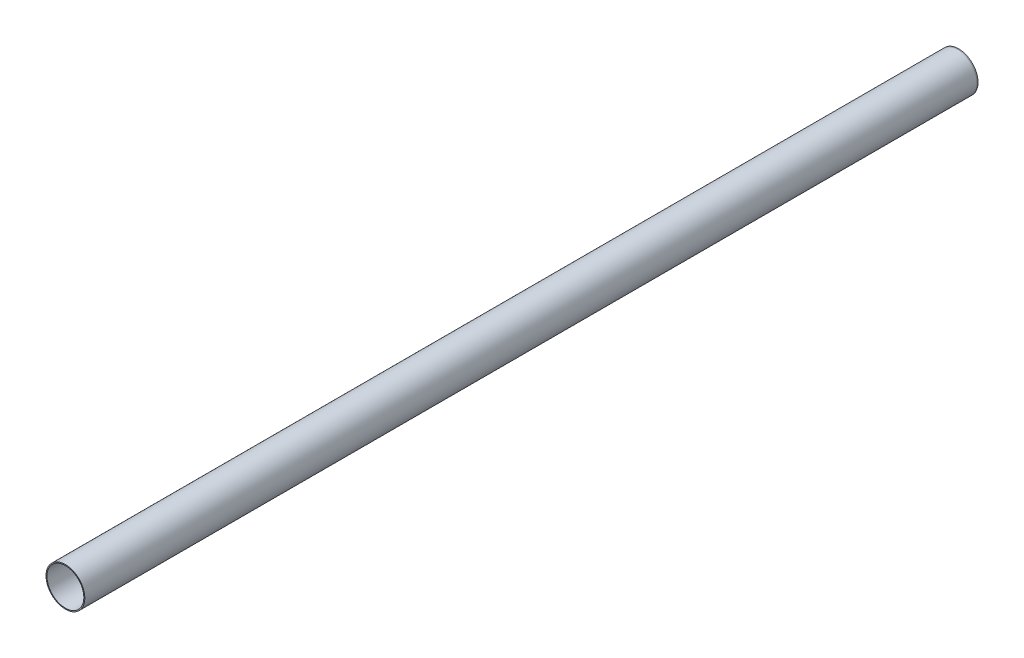
ISO-10303-21;
HEADER;
FILE_DESCRIPTION(('STEP AP214'),'2;1');
FILE_NAME('part.step','',(''),(''),'','','');
FILE_SCHEMA(('AUTOMOTIVE_DESIGN { 1 0 10303 214 1 1 1 1 }'));
ENDSEC;
DATA;
#1=APPLICATION_CONTEXT('core data for automotive mechanical design processes');
#2=APPLICATION_PROTOCOL_DEFINITION('international standard','automotive_design',2000,#1);
#3=PRODUCT_CONTEXT('',#1,'mechanical');
#4=PRODUCT('Part','Part','',(#3));
#5=PRODUCT_RELATED_PRODUCT_CATEGORY('part','',(#4));
#6=PRODUCT_DEFINITION_FORMATION('','',#4);
#7=PRODUCT_DEFINITION_CONTEXT('part definition',#1,'design');
#8=PRODUCT_DEFINITION('design','',#6,#7);
#9=PRODUCT_DEFINITION_SHAPE('','',#8);
#10=(LENGTH_UNIT() NAMED_UNIT(*) SI_UNIT(.MILLI.,.METRE.));
#11=(NAMED_UNIT(*) PLANE_ANGLE_UNIT() SI_UNIT($,.RADIAN.));
#12=(NAMED_UNIT(*) SI_UNIT($,.STERADIAN.) SOLID_ANGLE_UNIT());
#13=UNCERTAINTY_MEASURE_WITH_UNIT(LENGTH_MEASURE(1.E-05),#10,'distance_accuracy_value','');
#14=(GEOMETRIC_REPRESENTATION_CONTEXT(3) GLOBAL_UNCERTAINTY_ASSIGNED_CONTEXT((#13)) GLOBAL_UNIT_ASSIGNED_CONTEXT((#10,
#11,#12)) REPRESENTATION_CONTEXT('',''));
#15=CARTESIAN_POINT('',(0.,0.,0.));
#16=DIRECTION('',(0.,0.,1.));
#17=DIRECTION('',(1.,0.,0.));
#18=AXIS2_PLACEMENT_3D('',#15,#16,#17);
#19=CARTESIAN_POINT('',(0.,0.,-460.5));
#20=DIRECTION('',(0.,0.,1.));
#21=DIRECTION('',(1.,0.,0.));
#22=AXIS2_PLACEMENT_3D('',#19,#20,#21);
#23=CYLINDRICAL_SURFACE('',#22,10.);
#24=CARTESIAN_POINT('',(0.,0.,-460.5));
#25=DIRECTION('',(0.,0.,-1.));
#26=DIRECTION('',(-1.,0.,0.));
#27=AXIS2_PLACEMENT_3D('',#24,#25,#26);
#28=CIRCLE('',#27,10.);
#29=CARTESIAN_POINT('',(-10.,0.,-460.5));
#30=VERTEX_POINT('',#29);
#31=EDGE_CURVE('E12',#30,#30,#28,.T.);
#32=ORIENTED_EDGE('',*,*,#31,.F.);
#33=EDGE_LOOP('',(#32));
#34=FACE_BOUND('',#33,.T.);
#35=CARTESIAN_POINT('',(0.,0.,-460.));
#36=DIRECTION('',(0.,0.,-1.));
#37=DIRECTION('',(-1.,0.,0.));
#38=AXIS2_PLACEMENT_3D('',#35,#36,#37);
#39=CIRCLE('',#38,10.);
#40=CARTESIAN_POINT('',(-10.,0.,-460.));
#41=VERTEX_POINT('',#40);
#42=EDGE_CURVE('E55',#41,#41,#39,.T.);
#43=ORIENTED_EDGE('',*,*,#42,.T.);
#44=EDGE_LOOP('',(#43));
#45=FACE_BOUND('',#44,.T.);
#46=ADVANCED_FACE('F52',(#34,#45),#23,.T.);
#47=CARTESIAN_POINT('',(0.,0.,-460.5));
#48=DIRECTION('',(0.,0.,-1.));
#49=DIRECTION('',(-1.,0.,0.));
#50=AXIS2_PLACEMENT_3D('',#47,#48,#49);
#51=PLANE('',#50);
#52=ORIENTED_EDGE('',*,*,#31,.T.);
#53=EDGE_LOOP('',(#52));
#54=FACE_BOUND('',#53,.T.);
#55=ADVANCED_FACE('F67',(#54),#51,.T.);
#56=CARTESIAN_POINT('',(0.,0.,-460.));
#57=DIRECTION('',(0.,0.,-1.));
#58=DIRECTION('',(-1.,0.,0.));
#59=AXIS2_PLACEMENT_3D('',#56,#57,#58);
#60=PLANE('',#59);
#61=ORIENTED_EDGE('',*,*,#42,.F.);
#62=EDGE_LOOP('',(#61));
#63=FACE_BOUND('',#62,.T.);
#64=ADVANCED_FACE('F65',(#63),#60,.F.);
#65=CLOSED_SHELL('',(#46,#55,#64));
#66=MANIFOLD_SOLID_BREP('B2',#65);
#67=CARTESIAN_POINT('',(0.,0.,-460.));
#68=DIRECTION('',(0.,0.,1.));
#69=DIRECTION('',(1.,0.,0.));
#70=AXIS2_PLACEMENT_3D('',#67,#68,#69);
#71=CYLINDRICAL_SURFACE('',#70,9.5);
#72=CARTESIAN_POINT('',(0.,0.,-460.));
#73=DIRECTION('',(0.,0.,-1.));
#74=DIRECTION('',(-1.,0.,0.));
#75=AXIS2_PLACEMENT_3D('',#72,#73,#74);
#76=CIRCLE('',#75,9.5);
#77=CARTESIAN_POINT('',(-9.5,0.,-460.));
#78=VERTEX_POINT('',#77);
#79=EDGE_CURVE('E100',#78,#78,#76,.T.);
#80=ORIENTED_EDGE('',*,*,#79,.T.);
#81=EDGE_LOOP('',(#80));
#82=FACE_BOUND('',#81,.T.);
#83=CARTESIAN_POINT('',(0.,0.,0.));
#84=DIRECTION('',(0.,0.,-1.));
#85=DIRECTION('',(-1.,0.,0.));
#86=AXIS2_PLACEMENT_3D('',#83,#84,#85);
#87=CIRCLE('',#86,9.5);
#88=CARTESIAN_POINT('',(-9.5,0.,0.));
#89=VERTEX_POINT('',#88);
#90=EDGE_CURVE('E106',#89,#89,#87,.T.);
#91=ORIENTED_EDGE('',*,*,#90,.F.);
#92=EDGE_LOOP('',(#91));
#93=FACE_BOUND('',#92,.T.);
#94=ADVANCED_FACE('F93',(#82,#93),#71,.F.);
#95=CARTESIAN_POINT('',(0.,0.,-460.));
#96=DIRECTION('',(0.,0.,1.));
#97=DIRECTION('',(1.,0.,0.));
#98=AXIS2_PLACEMENT_3D('',#95,#96,#97);
#99=CYLINDRICAL_SURFACE('',#98,10.);
#100=CARTESIAN_POINT('',(0.,0.,-460.));
#101=DIRECTION('',(0.,0.,-1.));
#102=DIRECTION('',(-1.,0.,0.));
#103=AXIS2_PLACEMENT_3D('',#100,#101,#102);
#104=CIRCLE('',#103,10.);
#105=CARTESIAN_POINT('',(-10.,0.,-460.));
#106=VERTEX_POINT('',#105);
#107=EDGE_CURVE('E51',#106,#106,#104,.T.);
#108=ORIENTED_EDGE('',*,*,#107,.F.);
#109=EDGE_LOOP('',(#108));
#110=FACE_BOUND('',#109,.T.);
#111=CARTESIAN_POINT('',(0.,0.,0.));
#112=DIRECTION('',(0.,0.,-1.));
#113=DIRECTION('',(-1.,0.,0.));
#114=AXIS2_PLACEMENT_3D('',#111,#112,#113);
#115=CIRCLE('',#114,10.);
#116=CARTESIAN_POINT('',(-10.,0.,0.));
#117=VERTEX_POINT('',#116);
#118=EDGE_CURVE('E96',#117,#117,#115,.T.);
#119=ORIENTED_EDGE('',*,*,#118,.T.);
#120=EDGE_LOOP('',(#119));
#121=FACE_BOUND('',#120,.T.);
#122=ADVANCED_FACE('F113',(#110,#121),#99,.T.);
#123=CARTESIAN_POINT('',(0.,0.,-460.));
#124=DIRECTION('',(0.,0.,-1.));
#125=DIRECTION('',(-1.,0.,0.));
#126=AXIS2_PLACEMENT_3D('',#123,#124,#125);
#127=PLANE('',#126);
#128=ORIENTED_EDGE('',*,*,#79,.F.);
#129=EDGE_LOOP('',(#128));
#130=FACE_BOUND('',#129,.T.);
#131=ORIENTED_EDGE('',*,*,#107,.T.);
#132=EDGE_LOOP('',(#131));
#133=FACE_BOUND('',#132,.T.);
#134=ADVANCED_FACE('F117',(#130,#133),#127,.T.);
#135=CARTESIAN_POINT('',(0.,0.,0.));
#136=DIRECTION('',(0.,0.,-1.));
#137=DIRECTION('',(-1.,0.,0.));
#138=AXIS2_PLACEMENT_3D('',#135,#136,#137);
#139=PLANE('',#138);
#140=ORIENTED_EDGE('',*,*,#90,.T.);
#141=EDGE_LOOP('',(#140));
#142=FACE_BOUND('',#141,.T.);
#143=ORIENTED_EDGE('',*,*,#118,.F.);
#144=EDGE_LOOP('',(#143));
#145=FACE_BOUND('',#144,.T.);
#146=ADVANCED_FACE('F115',(#142,#145),#139,.F.);
#147=CLOSED_SHELL('',(#94,#122,#134,#146));
#148=MANIFOLD_SOLID_BREP('B7',#147);
#149=ADVANCED_BREP_SHAPE_REPRESENTATION('',(#18,#66,#148),#14);
#150=SHAPE_DEFINITION_REPRESENTATION(#9,#149);
ENDSEC;
END-ISO-10303-21;
